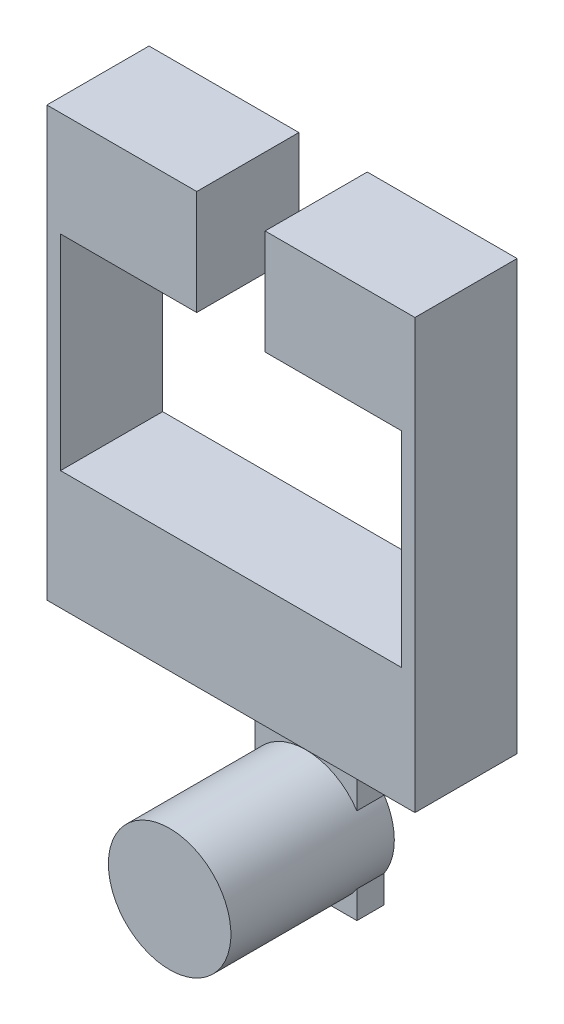
ISO-10303-21;
HEADER;
FILE_DESCRIPTION(('STEP AP214'),'2;1');
FILE_NAME('part.step','',(''),(''),'','','');
FILE_SCHEMA(('AUTOMOTIVE_DESIGN { 1 0 10303 214 1 1 1 1 }'));
ENDSEC;
DATA;
#1=APPLICATION_CONTEXT('core data for automotive mechanical design processes');
#2=APPLICATION_PROTOCOL_DEFINITION('international standard','automotive_design',2000,#1);
#3=PRODUCT_CONTEXT('',#1,'mechanical');
#4=PRODUCT('Part','Part','',(#3));
#5=PRODUCT_RELATED_PRODUCT_CATEGORY('part','',(#4));
#6=PRODUCT_DEFINITION_FORMATION('','',#4);
#7=PRODUCT_DEFINITION_CONTEXT('part definition',#1,'design');
#8=PRODUCT_DEFINITION('design','',#6,#7);
#9=PRODUCT_DEFINITION_SHAPE('','',#8);
#10=(LENGTH_UNIT() NAMED_UNIT(*) SI_UNIT(.MILLI.,.METRE.));
#11=(NAMED_UNIT(*) PLANE_ANGLE_UNIT() SI_UNIT($,.RADIAN.));
#12=(NAMED_UNIT(*) SI_UNIT($,.STERADIAN.) SOLID_ANGLE_UNIT());
#13=UNCERTAINTY_MEASURE_WITH_UNIT(LENGTH_MEASURE(1.E-05),#10,'distance_accuracy_value','');
#14=(GEOMETRIC_REPRESENTATION_CONTEXT(3) GLOBAL_UNCERTAINTY_ASSIGNED_CONTEXT((#13)) GLOBAL_UNIT_ASSIGNED_CONTEXT((#10,
#11,#12)) REPRESENTATION_CONTEXT('',''));
#15=CARTESIAN_POINT('',(0.,0.,0.));
#16=DIRECTION('',(0.,0.,1.));
#17=DIRECTION('',(1.,0.,0.));
#18=AXIS2_PLACEMENT_3D('',#15,#16,#17);
#19=CARTESIAN_POINT('',(9.52499999999999,0.,-4.445));
#20=DIRECTION('',(1.,0.,0.));
#21=DIRECTION('',(0.,1.,0.));
#22=AXIS2_PLACEMENT_3D('',#19,#20,#21);
#23=PLANE('',#22);
#24=DIRECTION('',(0.,0.,-1.));
#25=VECTOR('',#24,1.);
#26=CARTESIAN_POINT('',(9.52499999999998,-31.706675377923,20.955));
#27=LINE('',#26,#25);
#28=CARTESIAN_POINT('',(9.52499999999998,-31.706675377923,-4.445));
#29=VERTEX_POINT('',#28);
#30=CARTESIAN_POINT('',(9.52499999999998,-31.706675377923,-9.525));
#31=VERTEX_POINT('',#30);
#32=EDGE_CURVE('E204',#29,#31,#27,.T.);
#33=ORIENTED_EDGE('',*,*,#32,.F.);
#34=DIRECTION('',(0.,-1.,0.));
#35=VECTOR('',#34,1.);
#36=CARTESIAN_POINT('',(9.52499999999999,0.,-4.445));
#37=LINE('',#36,#35);
#38=CARTESIAN_POINT('',(9.52499999999998,-36.82365,-4.445));
#39=VERTEX_POINT('',#38);
#40=EDGE_CURVE('E226',#29,#39,#37,.T.);
#41=ORIENTED_EDGE('',*,*,#40,.T.);
#42=DIRECTION('',(0.,0.,-1.));
#43=VECTOR('',#42,1.);
#44=CARTESIAN_POINT('',(9.52499999999998,-36.82365,-4.445));
#45=LINE('',#44,#43);
#46=CARTESIAN_POINT('',(9.52499999999998,-36.82365,-9.525));
#47=VERTEX_POINT('',#46);
#48=EDGE_CURVE('E240',#39,#47,#45,.T.);
#49=ORIENTED_EDGE('',*,*,#48,.T.);
#50=DIRECTION('',(0.,-1.,0.));
#51=VECTOR('',#50,1.);
#52=CARTESIAN_POINT('',(9.52499999999999,0.,-9.525));
#53=LINE('',#52,#51);
#54=EDGE_CURVE('E323',#31,#47,#53,.T.);
#55=ORIENTED_EDGE('',*,*,#54,.F.);
#56=EDGE_LOOP('',(#33,#41,#49,#55));
#57=FACE_BOUND('',#56,.T.);
#58=ADVANCED_FACE('F52',(#57),#23,.T.);
#59=CARTESIAN_POINT('',(-9.52500000000001,0.,-4.445));
#60=DIRECTION('',(-1.,0.,0.));
#61=DIRECTION('',(0.,-1.,0.));
#62=AXIS2_PLACEMENT_3D('',#59,#60,#61);
#63=PLANE('',#62);
#64=DIRECTION('',(0.,0.,-1.));
#65=VECTOR('',#64,1.);
#66=CARTESIAN_POINT('',(-9.52500000000001,-19.093324622077,20.955));
#67=LINE('',#66,#65);
#68=CARTESIAN_POINT('',(-9.52500000000001,-19.093324622077,-4.445));
#69=VERTEX_POINT('',#68);
#70=CARTESIAN_POINT('',(-9.52500000000001,-19.093324622077,-9.525));
#71=VERTEX_POINT('',#70);
#72=EDGE_CURVE('E194',#69,#71,#67,.T.);
#73=ORIENTED_EDGE('',*,*,#72,.F.);
#74=DIRECTION('',(0.,1.,0.));
#75=VECTOR('',#74,1.);
#76=CARTESIAN_POINT('',(-9.52500000000001,0.,-4.445));
#77=LINE('',#76,#75);
#78=CARTESIAN_POINT('',(-9.52500000000001,0.,-4.445));
#79=VERTEX_POINT('',#78);
#80=EDGE_CURVE('E419',#69,#79,#77,.T.);
#81=ORIENTED_EDGE('',*,*,#80,.T.);
#82=DIRECTION('',(0.,0.,-1.));
#83=VECTOR('',#82,1.);
#84=CARTESIAN_POINT('',(-9.52500000000001,0.,-4.445));
#85=LINE('',#84,#83);
#86=CARTESIAN_POINT('',(-9.52500000000001,0.,-9.525));
#87=VERTEX_POINT('',#86);
#88=EDGE_CURVE('E218',#79,#87,#85,.T.);
#89=ORIENTED_EDGE('',*,*,#88,.T.);
#90=DIRECTION('',(0.,1.,0.));
#91=VECTOR('',#90,1.);
#92=CARTESIAN_POINT('',(-9.52500000000001,0.,-9.525));
#93=LINE('',#92,#91);
#94=EDGE_CURVE('E209',#71,#87,#93,.T.);
#95=ORIENTED_EDGE('',*,*,#94,.F.);
#96=EDGE_LOOP('',(#73,#81,#89,#95));
#97=FACE_BOUND('',#96,.T.);
#98=ADVANCED_FACE('F216',(#97),#63,.T.);
#99=CARTESIAN_POINT('',(0.,0.,-4.445));
#100=DIRECTION('',(0.,0.,-1.));
#101=DIRECTION('',(-1.,0.,0.));
#102=AXIS2_PLACEMENT_3D('',#99,#100,#101);
#103=PLANE('',#102);
#104=ORIENTED_EDGE('',*,*,#80,.F.);
#105=CARTESIAN_POINT('',(0.,-25.4,-4.445));
#106=DIRECTION('',(0.,0.,-1.));
#107=DIRECTION('',(-1.,0.,0.));
#108=AXIS2_PLACEMENT_3D('',#105,#106,#107);
#109=CIRCLE('',#108,11.42365);
#110=CARTESIAN_POINT('',(9.52499999999999,-19.093324622077,-4.445));
#111=VERTEX_POINT('',#110);
#112=EDGE_CURVE('E12',#69,#111,#109,.T.);
#113=ORIENTED_EDGE('',*,*,#112,.T.);
#114=CARTESIAN_POINT('',(9.52499999999999,0.,-4.445));
#115=VERTEX_POINT('',#114);
#116=EDGE_CURVE('E324',#115,#111,#37,.T.);
#117=ORIENTED_EDGE('',*,*,#116,.F.);
#118=DIRECTION('',(1.,0.,0.));
#119=VECTOR('',#118,1.);
#120=CARTESIAN_POINT('',(9.52499999999999,0.,-4.445));
#121=LINE('',#120,#119);
#122=EDGE_CURVE('E245',#79,#115,#121,.T.);
#123=ORIENTED_EDGE('',*,*,#122,.F.);
#124=EDGE_LOOP('',(#104,#113,#117,#123));
#125=FACE_BOUND('',#124,.T.);
#126=ADVANCED_FACE('F673',(#125),#103,.F.);
#127=ORIENTED_EDGE('',*,*,#40,.F.);
#128=CARTESIAN_POINT('',(0.,-36.82365,-4.445));
#129=VERTEX_POINT('',#128);
#130=EDGE_CURVE('E63',#29,#129,#109,.T.);
#131=ORIENTED_EDGE('',*,*,#130,.T.);
#132=DIRECTION('',(-1.,0.,0.));
#133=VECTOR('',#132,1.);
#134=CARTESIAN_POINT('',(9.52499999999998,-36.82365,-4.445));
#135=LINE('',#134,#133);
#136=EDGE_CURVE('E330',#39,#129,#135,.T.);
#137=ORIENTED_EDGE('',*,*,#136,.F.);
#138=EDGE_LOOP('',(#127,#131,#137));
#139=FACE_BOUND('',#138,.T.);
#140=ADVANCED_FACE('F408',(#139),#103,.F.);
#141=CARTESIAN_POINT('',(-34.32048,0.,9.525));
#142=DIRECTION('',(0.,1.,0.));
#143=DIRECTION('',(0.,0.,1.));
#144=AXIS2_PLACEMENT_3D('',#141,#142,#143);
#145=PLANE('',#144);
#146=ORIENTED_EDGE('',*,*,#88,.F.);
#147=ORIENTED_EDGE('',*,*,#122,.T.);
#148=DIRECTION('',(0.,0.,-1.));
#149=VECTOR('',#148,1.);
#150=CARTESIAN_POINT('',(9.52499999999999,0.,-4.445));
#151=LINE('',#150,#149);
#152=CARTESIAN_POINT('',(9.52499999999999,0.,-9.525));
#153=VERTEX_POINT('',#152);
#154=EDGE_CURVE('E231',#115,#153,#151,.T.);
#155=ORIENTED_EDGE('',*,*,#154,.T.);
#156=DIRECTION('',(1.,0.,0.));
#157=VECTOR('',#156,1.);
#158=CARTESIAN_POINT('',(-34.32048,0.,-9.525));
#159=LINE('',#158,#157);
#160=CARTESIAN_POINT('',(34.32048,0.,-9.525));
#161=VERTEX_POINT('',#160);
#162=EDGE_CURVE('E366',#153,#161,#159,.T.);
#163=ORIENTED_EDGE('',*,*,#162,.T.);
#164=DIRECTION('',(0.,0.,-1.));
#165=VECTOR('',#164,1.);
#166=CARTESIAN_POINT('',(34.32048,0.,9.525));
#167=LINE('',#166,#165);
#168=CARTESIAN_POINT('',(34.32048,0.,9.525));
#169=VERTEX_POINT('',#168);
#170=EDGE_CURVE('E385',#169,#161,#167,.T.);
#171=ORIENTED_EDGE('',*,*,#170,.F.);
#172=DIRECTION('',(1.,0.,0.));
#173=VECTOR('',#172,1.);
#174=CARTESIAN_POINT('',(-34.32048,0.,9.525));
#175=LINE('',#174,#173);
#176=CARTESIAN_POINT('',(-34.32048,0.,9.525));
#177=VERTEX_POINT('',#176);
#178=EDGE_CURVE('E573',#177,#169,#175,.T.);
#179=ORIENTED_EDGE('',*,*,#178,.F.);
#180=DIRECTION('',(0.,0.,-1.));
#181=VECTOR('',#180,1.);
#182=CARTESIAN_POINT('',(-34.32048,0.,9.525));
#183=LINE('',#182,#181);
#184=CARTESIAN_POINT('',(-34.32048,0.,-9.525));
#185=VERTEX_POINT('',#184);
#186=EDGE_CURVE('E389',#177,#185,#183,.T.);
#187=ORIENTED_EDGE('',*,*,#186,.T.);
#188=EDGE_CURVE('E361',#185,#87,#159,.T.);
#189=ORIENTED_EDGE('',*,*,#188,.T.);
#190=EDGE_LOOP('',(#146,#147,#155,#163,#171,#179,#187,#189));
#191=FACE_BOUND('',#190,.T.);
#192=ADVANCED_FACE('F654',(#191),#145,.F.);
#193=CARTESIAN_POINT('',(-34.32048,79.9750208357062,9.525));
#194=DIRECTION('',(0.,-1.,0.));
#195=DIRECTION('',(0.,0.,-1.));
#196=AXIS2_PLACEMENT_3D('',#193,#194,#195);
#197=PLANE('',#196);
#198=DIRECTION('',(-1.,0.,0.));
#199=VECTOR('',#198,1.);
#200=CARTESIAN_POINT('',(-34.32048,79.9750208357062,9.525));
#201=LINE('',#200,#199);
#202=CARTESIAN_POINT('',(-6.3754,79.9750208357062,9.525));
#203=VERTEX_POINT('',#202);
#204=CARTESIAN_POINT('',(-34.32048,79.9750208357062,9.525));
#205=VERTEX_POINT('',#204);
#206=EDGE_CURVE('E581',#203,#205,#201,.T.);
#207=ORIENTED_EDGE('',*,*,#206,.F.);
#208=DIRECTION('',(0.,0.,1.));
#209=VECTOR('',#208,1.);
#210=CARTESIAN_POINT('',(-6.3754,79.9750208357062,-9.525));
#211=LINE('',#210,#209);
#212=CARTESIAN_POINT('',(-6.3754,79.9750208357062,-9.525));
#213=VERTEX_POINT('',#212);
#214=EDGE_CURVE('E499',#213,#203,#211,.T.);
#215=ORIENTED_EDGE('',*,*,#214,.F.);
#216=DIRECTION('',(-1.,0.,0.));
#217=VECTOR('',#216,1.);
#218=CARTESIAN_POINT('',(-34.32048,79.9750208357062,-9.525));
#219=LINE('',#218,#217);
#220=CARTESIAN_POINT('',(-34.32048,79.9750208357062,-9.525));
#221=VERTEX_POINT('',#220);
#222=EDGE_CURVE('E370',#213,#221,#219,.T.);
#223=ORIENTED_EDGE('',*,*,#222,.T.);
#224=DIRECTION('',(0.,0.,-1.));
#225=VECTOR('',#224,1.);
#226=CARTESIAN_POINT('',(-34.32048,79.9750208357062,9.525));
#227=LINE('',#226,#225);
#228=EDGE_CURVE('E377',#205,#221,#227,.T.);
#229=ORIENTED_EDGE('',*,*,#228,.F.);
#230=EDGE_LOOP('',(#207,#215,#223,#229));
#231=FACE_BOUND('',#230,.T.);
#232=ADVANCED_FACE('F650',(#231),#197,.F.);
#233=CARTESIAN_POINT('',(-31.78048,60.4170208357062,-9.525));
#234=DIRECTION('',(0.,1.,0.));
#235=DIRECTION('',(-1.,0.,0.));
#236=AXIS2_PLACEMENT_3D('',#233,#234,#235);
#237=PLANE('',#236);
#238=DIRECTION('',(-1.,0.,0.));
#239=VECTOR('',#238,1.);
#240=CARTESIAN_POINT('',(-31.78048,60.4170208357062,-9.525));
#241=LINE('',#240,#239);
#242=CARTESIAN_POINT('',(-6.3754,60.4170208357062,-9.525));
#243=VERTEX_POINT('',#242);
#244=CARTESIAN_POINT('',(-31.78048,60.4170208357062,-9.525));
#245=VERTEX_POINT('',#244);
#246=EDGE_CURVE('E530',#243,#245,#241,.T.);
#247=ORIENTED_EDGE('',*,*,#246,.F.);
#248=DIRECTION('',(0.,0.,1.));
#249=VECTOR('',#248,1.);
#250=CARTESIAN_POINT('',(-6.3754,60.4170208357062,-9.525));
#251=LINE('',#250,#249);
#252=CARTESIAN_POINT('',(-6.3754,60.4170208357062,9.525));
#253=VERTEX_POINT('',#252);
#254=EDGE_CURVE('E294',#243,#253,#251,.T.);
#255=ORIENTED_EDGE('',*,*,#254,.T.);
#256=DIRECTION('',(-1.,0.,0.));
#257=VECTOR('',#256,1.);
#258=CARTESIAN_POINT('',(-31.78048,60.4170208357062,9.525));
#259=LINE('',#258,#257);
#260=CARTESIAN_POINT('',(-31.78048,60.4170208357062,9.525));
#261=VERTEX_POINT('',#260);
#262=EDGE_CURVE('E270',#253,#261,#259,.T.);
#263=ORIENTED_EDGE('',*,*,#262,.T.);
#264=DIRECTION('',(0.,0.,1.));
#265=VECTOR('',#264,1.);
#266=CARTESIAN_POINT('',(-31.78048,60.4170208357062,-9.525));
#267=LINE('',#266,#265);
#268=EDGE_CURVE('E273',#245,#261,#267,.T.);
#269=ORIENTED_EDGE('',*,*,#268,.F.);
#270=EDGE_LOOP('',(#247,#255,#263,#269));
#271=FACE_BOUND('',#270,.T.);
#272=ADVANCED_FACE('F642',(#271),#237,.F.);
#273=CARTESIAN_POINT('',(-34.32048,79.9750208357062,9.525));
#274=DIRECTION('',(1.,0.,0.));
#275=DIRECTION('',(0.,1.,0.));
#276=AXIS2_PLACEMENT_3D('',#273,#274,#275);
#277=PLANE('',#276);
#278=DIRECTION('',(0.,-1.,0.));
#279=VECTOR('',#278,1.);
#280=CARTESIAN_POINT('',(-34.32048,79.9750208357062,-9.525));
#281=LINE('',#280,#279);
#282=EDGE_CURVE('E278',#221,#185,#281,.T.);
#283=ORIENTED_EDGE('',*,*,#282,.T.);
#284=ORIENTED_EDGE('',*,*,#186,.F.);
#285=DIRECTION('',(0.,-1.,0.));
#286=VECTOR('',#285,1.);
#287=CARTESIAN_POINT('',(-34.32048,79.9750208357062,9.525));
#288=LINE('',#287,#286);
#289=EDGE_CURVE('E376',#205,#177,#288,.T.);
#290=ORIENTED_EDGE('',*,*,#289,.F.);
#291=ORIENTED_EDGE('',*,*,#228,.T.);
#292=EDGE_LOOP('',(#283,#284,#290,#291));
#293=FACE_BOUND('',#292,.T.);
#294=ADVANCED_FACE('F54',(#293),#277,.F.);
#295=CARTESIAN_POINT('',(34.32048,79.9750208357062,9.525));
#296=DIRECTION('',(-1.,0.,0.));
#297=DIRECTION('',(0.,-1.,0.));
#298=AXIS2_PLACEMENT_3D('',#295,#296,#297);
#299=PLANE('',#298);
#300=DIRECTION('',(0.,1.,0.));
#301=VECTOR('',#300,1.);
#302=CARTESIAN_POINT('',(34.32048,79.9750208357062,-9.525));
#303=LINE('',#302,#301);
#304=CARTESIAN_POINT('',(34.32048,79.9750208357062,-9.525));
#305=VERTEX_POINT('',#304);
#306=EDGE_CURVE('E365',#161,#305,#303,.T.);
#307=ORIENTED_EDGE('',*,*,#306,.T.);
#308=DIRECTION('',(0.,0.,-1.));
#309=VECTOR('',#308,1.);
#310=CARTESIAN_POINT('',(34.32048,79.9750208357062,9.525));
#311=LINE('',#310,#309);
#312=CARTESIAN_POINT('',(34.32048,79.9750208357062,9.525));
#313=VERTEX_POINT('',#312);
#314=EDGE_CURVE('E381',#313,#305,#311,.T.);
#315=ORIENTED_EDGE('',*,*,#314,.F.);
#316=DIRECTION('',(0.,1.,0.));
#317=VECTOR('',#316,1.);
#318=CARTESIAN_POINT('',(34.32048,79.9750208357062,9.525));
#319=LINE('',#318,#317);
#320=EDGE_CURVE('E577',#169,#313,#319,.T.);
#321=ORIENTED_EDGE('',*,*,#320,.F.);
#322=ORIENTED_EDGE('',*,*,#170,.T.);
#323=EDGE_LOOP('',(#307,#315,#321,#322));
#324=FACE_BOUND('',#323,.T.);
#325=ADVANCED_FACE('F657',(#324),#299,.F.);
#326=CARTESIAN_POINT('',(6.3754,79.9750208357062,-9.525));
#327=VERTEX_POINT('',#326);
#328=EDGE_CURVE('E371',#305,#327,#219,.T.);
#329=ORIENTED_EDGE('',*,*,#328,.T.);
#330=DIRECTION('',(0.,0.,1.));
#331=VECTOR('',#330,1.);
#332=CARTESIAN_POINT('',(6.3754,79.9750208357062,-9.525));
#333=LINE('',#332,#331);
#334=CARTESIAN_POINT('',(6.3754,79.9750208357062,9.525));
#335=VERTEX_POINT('',#334);
#336=EDGE_CURVE('E293',#327,#335,#333,.T.);
#337=ORIENTED_EDGE('',*,*,#336,.T.);
#338=EDGE_CURVE('E382',#313,#335,#201,.T.);
#339=ORIENTED_EDGE('',*,*,#338,.F.);
#340=ORIENTED_EDGE('',*,*,#314,.T.);
#341=EDGE_LOOP('',(#329,#337,#339,#340));
#342=FACE_BOUND('',#341,.T.);
#343=ADVANCED_FACE('F616',(#342),#197,.F.);
#344=CARTESIAN_POINT('',(0.,0.,9.525));
#345=DIRECTION('',(0.,0.,1.));
#346=DIRECTION('',(1.,0.,0.));
#347=AXIS2_PLACEMENT_3D('',#344,#345,#346);
#348=PLANE('',#347);
#349=DIRECTION('',(0.,-1.,0.));
#350=VECTOR('',#349,1.);
#351=CARTESIAN_POINT('',(-6.3754,79.9750208357062,9.525));
#352=LINE('',#351,#350);
#353=EDGE_CURVE('E234',#203,#253,#352,.T.);
#354=ORIENTED_EDGE('',*,*,#353,.F.);
#355=ORIENTED_EDGE('',*,*,#206,.T.);
#356=ORIENTED_EDGE('',*,*,#289,.T.);
#357=ORIENTED_EDGE('',*,*,#178,.T.);
#358=ORIENTED_EDGE('',*,*,#320,.T.);
#359=ORIENTED_EDGE('',*,*,#338,.T.);
#360=DIRECTION('',(0.,1.,0.));
#361=VECTOR('',#360,1.);
#362=CARTESIAN_POINT('',(6.3754,79.9750208357062,9.525));
#363=LINE('',#362,#361);
#364=CARTESIAN_POINT('',(6.3754,60.4170208357062,9.525));
#365=VERTEX_POINT('',#364);
#366=EDGE_CURVE('E252',#365,#335,#363,.T.);
#367=ORIENTED_EDGE('',*,*,#366,.F.);
#368=CARTESIAN_POINT('',(31.78048,60.4170208357062,9.525));
#369=VERTEX_POINT('',#368);
#370=EDGE_CURVE('E263',#369,#365,#259,.T.);
#371=ORIENTED_EDGE('',*,*,#370,.F.);
#372=DIRECTION('',(0.,1.,0.));
#373=VECTOR('',#372,1.);
#374=CARTESIAN_POINT('',(31.78048,60.4170208357062,9.525));
#375=LINE('',#374,#373);
#376=CARTESIAN_POINT('',(31.78048,22.1900208357063,9.525));
#377=VERTEX_POINT('',#376);
#378=EDGE_CURVE('E271',#377,#369,#375,.T.);
#379=ORIENTED_EDGE('',*,*,#378,.F.);
#380=DIRECTION('',(1.,0.,0.));
#381=VECTOR('',#380,1.);
#382=CARTESIAN_POINT('',(-31.78048,22.1900208357062,9.525));
#383=LINE('',#382,#381);
#384=CARTESIAN_POINT('',(-31.78048,22.1900208357062,9.525));
#385=VERTEX_POINT('',#384);
#386=EDGE_CURVE('E507',#385,#377,#383,.T.);
#387=ORIENTED_EDGE('',*,*,#386,.F.);
#388=DIRECTION('',(0.,-1.,0.));
#389=VECTOR('',#388,1.);
#390=CARTESIAN_POINT('',(-31.78048,60.4170208357062,9.525));
#391=LINE('',#390,#389);
#392=EDGE_CURVE('E503',#261,#385,#391,.T.);
#393=ORIENTED_EDGE('',*,*,#392,.F.);
#394=ORIENTED_EDGE('',*,*,#262,.F.);
#395=EDGE_LOOP('',(#354,#355,#356,#357,#358,#359,#367,#371,#379,#387,#393,#394));
#396=FACE_BOUND('',#395,.T.);
#397=ADVANCED_FACE('F611',(#396),#348,.T.);
#398=CARTESIAN_POINT('',(0.,0.,-9.525));
#399=DIRECTION('',(0.,0.,1.));
#400=DIRECTION('',(1.,0.,0.));
#401=AXIS2_PLACEMENT_3D('',#398,#399,#400);
#402=PLANE('',#401);
#403=DIRECTION('',(-1.,0.,0.));
#404=VECTOR('',#403,1.);
#405=CARTESIAN_POINT('',(9.52499999999998,-36.82365,-9.525));
#406=LINE('',#405,#404);
#407=CARTESIAN_POINT('',(-9.52500000000002,-36.82365,-9.525));
#408=VERTEX_POINT('',#407);
#409=EDGE_CURVE('E221',#47,#408,#406,.T.);
#410=ORIENTED_EDGE('',*,*,#409,.T.);
#411=CARTESIAN_POINT('',(-9.52500000000001,-31.706675377923,-9.525));
#412=VERTEX_POINT('',#411);
#413=EDGE_CURVE('E212',#408,#412,#93,.T.);
#414=ORIENTED_EDGE('',*,*,#413,.T.);
#415=CARTESIAN_POINT('',(0.,-25.4,-9.525));
#416=DIRECTION('',(0.,0.,-1.));
#417=DIRECTION('',(-1.,0.,0.));
#418=AXIS2_PLACEMENT_3D('',#415,#416,#417);
#419=CIRCLE('',#418,11.42365);
#420=EDGE_CURVE('E198',#412,#71,#419,.T.);
#421=ORIENTED_EDGE('',*,*,#420,.T.);
#422=ORIENTED_EDGE('',*,*,#94,.T.);
#423=ORIENTED_EDGE('',*,*,#188,.F.);
#424=ORIENTED_EDGE('',*,*,#282,.F.);
#425=ORIENTED_EDGE('',*,*,#222,.F.);
#426=DIRECTION('',(0.,-1.,0.));
#427=VECTOR('',#426,1.);
#428=CARTESIAN_POINT('',(-6.3754,79.9750208357062,-9.525));
#429=LINE('',#428,#427);
#430=EDGE_CURVE('E246',#213,#243,#429,.T.);
#431=ORIENTED_EDGE('',*,*,#430,.T.);
#432=ORIENTED_EDGE('',*,*,#246,.T.);
#433=DIRECTION('',(0.,-1.,0.));
#434=VECTOR('',#433,1.);
#435=CARTESIAN_POINT('',(-31.78048,60.4170208357062,-9.525));
#436=LINE('',#435,#434);
#437=CARTESIAN_POINT('',(-31.78048,22.1900208357062,-9.525));
#438=VERTEX_POINT('',#437);
#439=EDGE_CURVE('E269',#245,#438,#436,.T.);
#440=ORIENTED_EDGE('',*,*,#439,.T.);
#441=DIRECTION('',(1.,0.,0.));
#442=VECTOR('',#441,1.);
#443=CARTESIAN_POINT('',(-31.78048,22.1900208357062,-9.525));
#444=LINE('',#443,#442);
#445=CARTESIAN_POINT('',(31.78048,22.1900208357063,-9.525));
#446=VERTEX_POINT('',#445);
#447=EDGE_CURVE('E304',#438,#446,#444,.T.);
#448=ORIENTED_EDGE('',*,*,#447,.T.);
#449=DIRECTION('',(0.,1.,0.));
#450=VECTOR('',#449,1.);
#451=CARTESIAN_POINT('',(31.78048,60.4170208357062,-9.525));
#452=LINE('',#451,#450);
#453=CARTESIAN_POINT('',(31.78048,60.4170208357062,-9.525));
#454=VERTEX_POINT('',#453);
#455=EDGE_CURVE('E309',#446,#454,#452,.T.);
#456=ORIENTED_EDGE('',*,*,#455,.T.);
#457=CARTESIAN_POINT('',(6.3754,60.4170208357062,-9.525));
#458=VERTEX_POINT('',#457);
#459=EDGE_CURVE('E534',#454,#458,#241,.T.);
#460=ORIENTED_EDGE('',*,*,#459,.T.);
#461=DIRECTION('',(0.,1.,0.));
#462=VECTOR('',#461,1.);
#463=CARTESIAN_POINT('',(6.3754,79.9750208357062,-9.525));
#464=LINE('',#463,#462);
#465=EDGE_CURVE('E251',#458,#327,#464,.T.);
#466=ORIENTED_EDGE('',*,*,#465,.T.);
#467=ORIENTED_EDGE('',*,*,#328,.F.);
#468=ORIENTED_EDGE('',*,*,#306,.F.);
#469=ORIENTED_EDGE('',*,*,#162,.F.);
#470=CARTESIAN_POINT('',(9.52499999999999,-19.093324622077,-9.525));
#471=VERTEX_POINT('',#470);
#472=EDGE_CURVE('E78',#153,#471,#53,.T.);
#473=ORIENTED_EDGE('',*,*,#472,.T.);
#474=EDGE_CURVE('E214',#471,#31,#419,.T.);
#475=ORIENTED_EDGE('',*,*,#474,.T.);
#476=ORIENTED_EDGE('',*,*,#54,.T.);
#477=EDGE_LOOP('',(#410,#414,#421,#422,#423,#424,#425,#431,#432,#440,#448,#456,#460,#466,#467,
#468,#469,#473,#475,#476));
#478=FACE_BOUND('',#477,.T.);
#479=ADVANCED_FACE('F208',(#478),#402,.F.);
#480=CARTESIAN_POINT('',(-31.78048,60.4170208357062,-9.525));
#481=DIRECTION('',(-1.,0.,0.));
#482=DIRECTION('',(0.,-1.,0.));
#483=AXIS2_PLACEMENT_3D('',#480,#481,#482);
#484=PLANE('',#483);
#485=ORIENTED_EDGE('',*,*,#392,.T.);
#486=DIRECTION('',(0.,0.,1.));
#487=VECTOR('',#486,1.);
#488=CARTESIAN_POINT('',(-31.78048,22.1900208357062,-9.525));
#489=LINE('',#488,#487);
#490=EDGE_CURVE('E539',#438,#385,#489,.T.);
#491=ORIENTED_EDGE('',*,*,#490,.F.);
#492=ORIENTED_EDGE('',*,*,#439,.F.);
#493=ORIENTED_EDGE('',*,*,#268,.T.);
#494=EDGE_LOOP('',(#485,#491,#492,#493));
#495=FACE_BOUND('',#494,.T.);
#496=ADVANCED_FACE('F636',(#495),#484,.F.);
#497=ORIENTED_EDGE('',*,*,#370,.T.);
#498=DIRECTION('',(0.,0.,1.));
#499=VECTOR('',#498,1.);
#500=CARTESIAN_POINT('',(6.3754,60.4170208357062,-9.525));
#501=LINE('',#500,#499);
#502=EDGE_CURVE('E289',#458,#365,#501,.T.);
#503=ORIENTED_EDGE('',*,*,#502,.F.);
#504=ORIENTED_EDGE('',*,*,#459,.F.);
#505=DIRECTION('',(0.,0.,1.));
#506=VECTOR('',#505,1.);
#507=CARTESIAN_POINT('',(31.78048,60.4170208357062,-9.525));
#508=LINE('',#507,#506);
#509=EDGE_CURVE('E279',#454,#369,#508,.T.);
#510=ORIENTED_EDGE('',*,*,#509,.T.);
#511=EDGE_LOOP('',(#497,#503,#504,#510));
#512=FACE_BOUND('',#511,.T.);
#513=ADVANCED_FACE('F624',(#512),#237,.F.);
#514=CARTESIAN_POINT('',(31.78048,60.4170208357062,-9.525));
#515=DIRECTION('',(1.,0.,0.));
#516=DIRECTION('',(0.,1.,0.));
#517=AXIS2_PLACEMENT_3D('',#514,#515,#516);
#518=PLANE('',#517);
#519=ORIENTED_EDGE('',*,*,#378,.T.);
#520=ORIENTED_EDGE('',*,*,#509,.F.);
#521=ORIENTED_EDGE('',*,*,#455,.F.);
#522=DIRECTION('',(0.,0.,1.));
#523=VECTOR('',#522,1.);
#524=CARTESIAN_POINT('',(31.78048,22.1900208357063,-9.525));
#525=LINE('',#524,#523);
#526=EDGE_CURVE('E544',#446,#377,#525,.T.);
#527=ORIENTED_EDGE('',*,*,#526,.T.);
#528=EDGE_LOOP('',(#519,#520,#521,#527));
#529=FACE_BOUND('',#528,.T.);
#530=ADVANCED_FACE('F629',(#529),#518,.F.);
#531=CARTESIAN_POINT('',(-31.78048,22.1900208357062,-9.525));
#532=DIRECTION('',(0.,-1.,0.));
#533=DIRECTION('',(1.,0.,0.));
#534=AXIS2_PLACEMENT_3D('',#531,#532,#533);
#535=PLANE('',#534);
#536=ORIENTED_EDGE('',*,*,#386,.T.);
#537=ORIENTED_EDGE('',*,*,#526,.F.);
#538=ORIENTED_EDGE('',*,*,#447,.F.);
#539=ORIENTED_EDGE('',*,*,#490,.T.);
#540=EDGE_LOOP('',(#536,#537,#538,#539));
#541=FACE_BOUND('',#540,.T.);
#542=ADVANCED_FACE('F633',(#541),#535,.F.);
#543=CARTESIAN_POINT('',(6.3754,79.9750208357062,-9.525));
#544=DIRECTION('',(1.,0.,0.));
#545=DIRECTION('',(0.,1.,0.));
#546=AXIS2_PLACEMENT_3D('',#543,#544,#545);
#547=PLANE('',#546);
#548=ORIENTED_EDGE('',*,*,#366,.T.);
#549=ORIENTED_EDGE('',*,*,#336,.F.);
#550=ORIENTED_EDGE('',*,*,#465,.F.);
#551=ORIENTED_EDGE('',*,*,#502,.T.);
#552=EDGE_LOOP('',(#548,#549,#550,#551));
#553=FACE_BOUND('',#552,.T.);
#554=ADVANCED_FACE('F619',(#553),#547,.F.);
#555=CARTESIAN_POINT('',(-6.3754,79.9750208357062,-9.525));
#556=DIRECTION('',(-1.,0.,0.));
#557=DIRECTION('',(0.,-1.,0.));
#558=AXIS2_PLACEMENT_3D('',#555,#556,#557);
#559=PLANE('',#558);
#560=ORIENTED_EDGE('',*,*,#353,.T.);
#561=ORIENTED_EDGE('',*,*,#254,.F.);
#562=ORIENTED_EDGE('',*,*,#430,.F.);
#563=ORIENTED_EDGE('',*,*,#214,.T.);
#564=EDGE_LOOP('',(#560,#561,#562,#563));
#565=FACE_BOUND('',#564,.T.);
#566=ADVANCED_FACE('F644',(#565),#559,.F.);
#567=DIRECTION('',(0.,0.,-1.));
#568=VECTOR('',#567,1.);
#569=CARTESIAN_POINT('',(9.52499999999999,-19.093324622077,20.955));
#570=LINE('',#569,#568);
#571=EDGE_CURVE('E203',#471,#111,#570,.F.);
#572=ORIENTED_EDGE('',*,*,#571,.F.);
#573=ORIENTED_EDGE('',*,*,#472,.F.);
#574=ORIENTED_EDGE('',*,*,#154,.F.);
#575=ORIENTED_EDGE('',*,*,#116,.T.);
#576=EDGE_LOOP('',(#572,#573,#574,#575));
#577=FACE_BOUND('',#576,.T.);
#578=ADVANCED_FACE('F668',(#577),#23,.T.);
#579=DIRECTION('',(0.,0.,-1.));
#580=VECTOR('',#579,1.);
#581=CARTESIAN_POINT('',(-9.52500000000001,-31.706675377923,20.955));
#582=LINE('',#581,#580);
#583=CARTESIAN_POINT('',(-9.52500000000001,-31.706675377923,-4.445));
#584=VERTEX_POINT('',#583);
#585=EDGE_CURVE('E70',#412,#584,#582,.F.);
#586=ORIENTED_EDGE('',*,*,#585,.F.);
#587=ORIENTED_EDGE('',*,*,#413,.F.);
#588=DIRECTION('',(0.,0.,-1.));
#589=VECTOR('',#588,1.);
#590=CARTESIAN_POINT('',(-9.52500000000002,-36.82365,-4.445));
#591=LINE('',#590,#589);
#592=CARTESIAN_POINT('',(-9.52500000000002,-36.82365,-4.445));
#593=VERTEX_POINT('',#592);
#594=EDGE_CURVE('E237',#593,#408,#591,.T.);
#595=ORIENTED_EDGE('',*,*,#594,.F.);
#596=EDGE_CURVE('E343',#593,#584,#77,.T.);
#597=ORIENTED_EDGE('',*,*,#596,.T.);
#598=EDGE_LOOP('',(#586,#587,#595,#597));
#599=FACE_BOUND('',#598,.T.);
#600=ADVANCED_FACE('F427',(#599),#63,.T.);
#601=CARTESIAN_POINT('',(9.52499999999998,-36.82365,-4.445));
#602=DIRECTION('',(0.,-1.,0.));
#603=DIRECTION('',(1.,0.,0.));
#604=AXIS2_PLACEMENT_3D('',#601,#602,#603);
#605=PLANE('',#604);
#606=ORIENTED_EDGE('',*,*,#594,.T.);
#607=ORIENTED_EDGE('',*,*,#409,.F.);
#608=ORIENTED_EDGE('',*,*,#48,.F.);
#609=ORIENTED_EDGE('',*,*,#136,.T.);
#610=EDGE_CURVE('E329',#129,#593,#135,.T.);
#611=ORIENTED_EDGE('',*,*,#610,.T.);
#612=EDGE_LOOP('',(#606,#607,#608,#609,#611));
#613=FACE_BOUND('',#612,.T.);
#614=ADVANCED_FACE('F416',(#613),#605,.T.);
#615=ORIENTED_EDGE('',*,*,#610,.F.);
#616=EDGE_CURVE('E56',#129,#584,#109,.T.);
#617=ORIENTED_EDGE('',*,*,#616,.T.);
#618=ORIENTED_EDGE('',*,*,#596,.F.);
#619=EDGE_LOOP('',(#615,#617,#618));
#620=FACE_BOUND('',#619,.T.);
#621=ADVANCED_FACE('F411',(#620),#103,.F.);
#622=CARTESIAN_POINT('',(0.,-25.4,20.955));
#623=DIRECTION('',(0.,0.,-1.));
#624=DIRECTION('',(-1.,0.,0.));
#625=AXIS2_PLACEMENT_3D('',#622,#623,#624);
#626=CYLINDRICAL_SURFACE('',#625,11.42365);
#627=ORIENTED_EDGE('',*,*,#474,.F.);
#628=ORIENTED_EDGE('',*,*,#571,.T.);
#629=ORIENTED_EDGE('',*,*,#112,.F.);
#630=ORIENTED_EDGE('',*,*,#72,.T.);
#631=ORIENTED_EDGE('',*,*,#420,.F.);
#632=ORIENTED_EDGE('',*,*,#585,.T.);
#633=ORIENTED_EDGE('',*,*,#616,.F.);
#634=ORIENTED_EDGE('',*,*,#130,.F.);
#635=ORIENTED_EDGE('',*,*,#32,.T.);
#636=EDGE_LOOP('',(#627,#628,#629,#630,#631,#632,#633,#634,#635));
#637=FACE_BOUND('',#636,.T.);
#638=CARTESIAN_POINT('',(0.,-25.4,20.955));
#639=DIRECTION('',(0.,0.,-1.));
#640=DIRECTION('',(-1.,0.,0.));
#641=AXIS2_PLACEMENT_3D('',#638,#639,#640);
#642=CIRCLE('',#641,11.42365);
#643=CARTESIAN_POINT('',(-11.42365,-25.4,20.955));
#644=VERTEX_POINT('',#643);
#645=EDGE_CURVE('E350',#644,#644,#642,.T.);
#646=ORIENTED_EDGE('',*,*,#645,.T.);
#647=EDGE_LOOP('',(#646));
#648=FACE_BOUND('',#647,.T.);
#649=ADVANCED_FACE('F196',(#637,#648),#626,.T.);
#650=CARTESIAN_POINT('',(0.,-25.4,20.955));
#651=DIRECTION('',(0.,0.,-1.));
#652=DIRECTION('',(-1.,0.,0.));
#653=AXIS2_PLACEMENT_3D('',#650,#651,#652);
#654=PLANE('',#653);
#655=ORIENTED_EDGE('',*,*,#645,.F.);
#656=EDGE_LOOP('',(#655));
#657=FACE_BOUND('',#656,.T.);
#658=ADVANCED_FACE('F691',(#657),#654,.F.);
#659=CLOSED_SHELL('',(#58,#98,#126,#140,#192,#232,#272,#294,#325,#343,#397,#479,#496,#513,#530,
#542,#554,#566,#578,#600,#614,#621,#649,#658));
#660=MANIFOLD_SOLID_BREP('B2',#659);
#661=ADVANCED_BREP_SHAPE_REPRESENTATION('',(#18,#660),#14);
#662=SHAPE_DEFINITION_REPRESENTATION(#9,#661);
ENDSEC;
END-ISO-10303-21;
